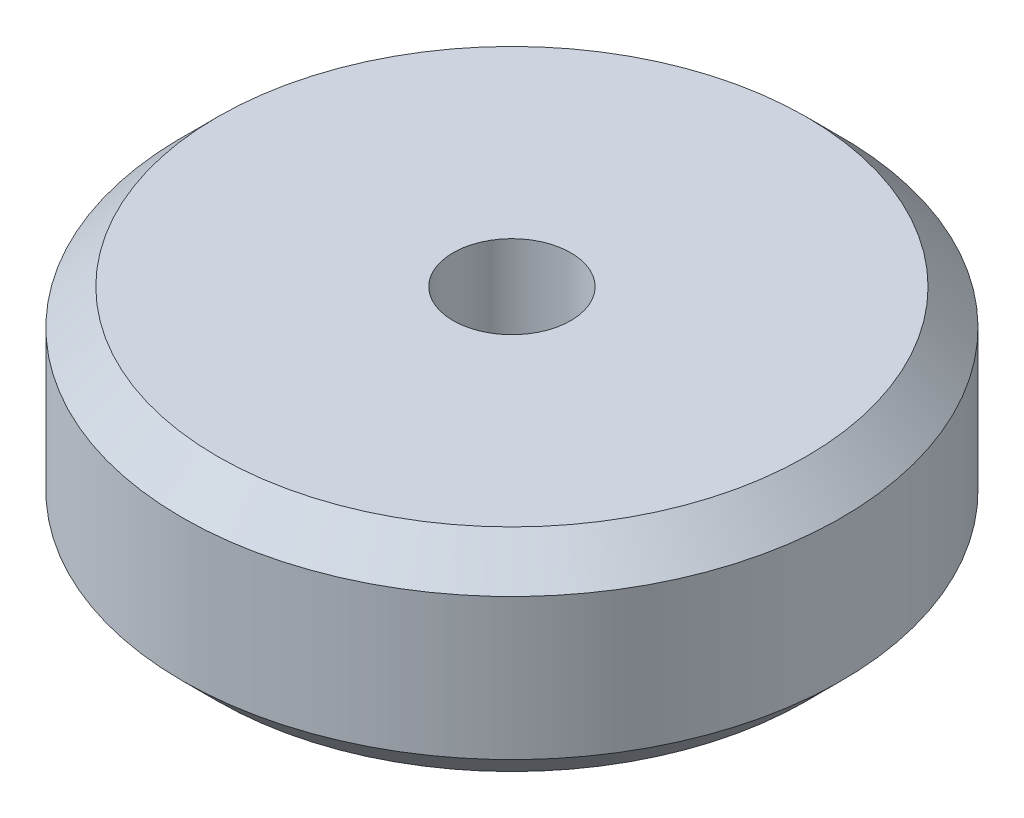
ISO-10303-21;
HEADER;
FILE_DESCRIPTION(('STEP AP214'),'2;1');
FILE_NAME('part.step','',(''),(''),'','','');
FILE_SCHEMA(('AUTOMOTIVE_DESIGN { 1 0 10303 214 1 1 1 1 }'));
ENDSEC;
DATA;
#1=APPLICATION_CONTEXT('core data for automotive mechanical design processes');
#2=APPLICATION_PROTOCOL_DEFINITION('international standard','automotive_design',2000,#1);
#3=PRODUCT_CONTEXT('',#1,'mechanical');
#4=PRODUCT('Part','Part','',(#3));
#5=PRODUCT_RELATED_PRODUCT_CATEGORY('part','',(#4));
#6=PRODUCT_DEFINITION_FORMATION('','',#4);
#7=PRODUCT_DEFINITION_CONTEXT('part definition',#1,'design');
#8=PRODUCT_DEFINITION('design','',#6,#7);
#9=PRODUCT_DEFINITION_SHAPE('','',#8);
#10=(LENGTH_UNIT() NAMED_UNIT(*) SI_UNIT(.MILLI.,.METRE.));
#11=(NAMED_UNIT(*) PLANE_ANGLE_UNIT() SI_UNIT($,.RADIAN.));
#12=(NAMED_UNIT(*) SI_UNIT($,.STERADIAN.) SOLID_ANGLE_UNIT());
#13=UNCERTAINTY_MEASURE_WITH_UNIT(LENGTH_MEASURE(1.E-05),#10,'distance_accuracy_value','');
#14=(GEOMETRIC_REPRESENTATION_CONTEXT(3) GLOBAL_UNCERTAINTY_ASSIGNED_CONTEXT((#13)) GLOBAL_UNIT_ASSIGNED_CONTEXT((#10,
#11,#12)) REPRESENTATION_CONTEXT('',''));
#15=CARTESIAN_POINT('',(0.,0.,0.));
#16=DIRECTION('',(0.,0.,1.));
#17=DIRECTION('',(1.,0.,0.));
#18=AXIS2_PLACEMENT_3D('',#15,#16,#17);
#19=CARTESIAN_POINT('',(0.,9.,0.));
#20=DIRECTION('',(0.,1.,0.));
#21=DIRECTION('',(0.,0.,1.));
#22=AXIS2_PLACEMENT_3D('',#19,#20,#21);
#23=PLANE('',#22);
#24=CARTESIAN_POINT('',(0.,9.,0.));
#25=DIRECTION('',(0.,1.,0.));
#26=DIRECTION('',(0.,0.,1.));
#27=AXIS2_PLACEMENT_3D('',#24,#25,#26);
#28=CIRCLE('',#27,12.5);
#29=CARTESIAN_POINT('',(0.,9.,12.5));
#30=VERTEX_POINT('',#29);
#31=EDGE_CURVE('E10',#30,#30,#28,.T.);
#32=ORIENTED_EDGE('',*,*,#31,.T.);
#33=EDGE_LOOP('',(#32));
#34=FACE_BOUND('',#33,.T.);
#35=CARTESIAN_POINT('',(0.,9.,0.));
#36=DIRECTION('',(0.,1.,0.));
#37=DIRECTION('',(0.,0.,1.));
#38=AXIS2_PLACEMENT_3D('',#35,#36,#37);
#39=CIRCLE('',#38,2.5);
#40=CARTESIAN_POINT('',(0.,9.,2.5));
#41=VERTEX_POINT('',#40);
#42=EDGE_CURVE('E62',#41,#41,#39,.T.);
#43=ORIENTED_EDGE('',*,*,#42,.F.);
#44=EDGE_LOOP('',(#43));
#45=FACE_BOUND('',#44,.T.);
#46=ADVANCED_FACE('F41',(#34,#45),#23,.T.);
#47=CARTESIAN_POINT('',(0.,0.,0.));
#48=DIRECTION('',(0.,1.,0.));
#49=DIRECTION('',(0.,0.,1.));
#50=AXIS2_PLACEMENT_3D('',#47,#48,#49);
#51=PLANE('',#50);
#52=CARTESIAN_POINT('',(0.,0.,0.));
#53=DIRECTION('',(0.,1.,0.));
#54=DIRECTION('',(0.,0.,1.));
#55=AXIS2_PLACEMENT_3D('',#52,#53,#54);
#56=CIRCLE('',#55,12.5);
#57=CARTESIAN_POINT('',(0.,0.,12.5));
#58=VERTEX_POINT('',#57);
#59=EDGE_CURVE('E49',#58,#58,#56,.F.);
#60=ORIENTED_EDGE('',*,*,#59,.T.);
#61=EDGE_LOOP('',(#60));
#62=FACE_BOUND('',#61,.T.);
#63=CARTESIAN_POINT('',(0.,0.,0.));
#64=DIRECTION('',(0.,1.,0.));
#65=DIRECTION('',(0.,0.,1.));
#66=AXIS2_PLACEMENT_3D('',#63,#64,#65);
#67=CIRCLE('',#66,2.5);
#68=CARTESIAN_POINT('',(0.,0.,2.5));
#69=VERTEX_POINT('',#68);
#70=EDGE_CURVE('E63',#69,#69,#67,.T.);
#71=ORIENTED_EDGE('',*,*,#70,.T.);
#72=EDGE_LOOP('',(#71));
#73=FACE_BOUND('',#72,.T.);
#74=ADVANCED_FACE('F73',(#62,#73),#51,.F.);
#75=CARTESIAN_POINT('',(0.,9.,0.));
#76=DIRECTION('',(0.,-1.,0.));
#77=DIRECTION('',(0.,0.,-1.));
#78=AXIS2_PLACEMENT_3D('',#75,#76,#77);
#79=CYLINDRICAL_SURFACE('',#78,14.);
#80=CARTESIAN_POINT('',(0.,1.5,0.));
#81=DIRECTION('',(0.,1.,0.));
#82=DIRECTION('',(0.,0.,1.));
#83=AXIS2_PLACEMENT_3D('',#80,#81,#82);
#84=CIRCLE('',#83,14.);
#85=CARTESIAN_POINT('',(0.,1.5,14.));
#86=VERTEX_POINT('',#85);
#87=EDGE_CURVE('E53',#86,#86,#84,.T.);
#88=ORIENTED_EDGE('',*,*,#87,.T.);
#89=EDGE_LOOP('',(#88));
#90=FACE_BOUND('',#89,.T.);
#91=CARTESIAN_POINT('',(0.,7.49999999999999,0.));
#92=DIRECTION('',(0.,1.,0.));
#93=DIRECTION('',(0.,0.,1.));
#94=AXIS2_PLACEMENT_3D('',#91,#92,#93);
#95=CIRCLE('',#94,14.);
#96=CARTESIAN_POINT('',(0.,7.49999999999999,14.));
#97=VERTEX_POINT('',#96);
#98=EDGE_CURVE('E57',#97,#97,#95,.F.);
#99=ORIENTED_EDGE('',*,*,#98,.T.);
#100=EDGE_LOOP('',(#99));
#101=FACE_BOUND('',#100,.T.);
#102=ADVANCED_FACE('F79',(#90,#101),#79,.T.);
#103=CARTESIAN_POINT('',(0.,9.,0.));
#104=DIRECTION('',(0.,-1.,0.));
#105=DIRECTION('',(0.,0.,-1.));
#106=AXIS2_PLACEMENT_3D('',#103,#104,#105);
#107=CYLINDRICAL_SURFACE('',#106,2.5);
#108=ORIENTED_EDGE('',*,*,#42,.T.);
#109=EDGE_LOOP('',(#108));
#110=FACE_BOUND('',#109,.T.);
#111=ORIENTED_EDGE('',*,*,#70,.F.);
#112=EDGE_LOOP('',(#111));
#113=FACE_BOUND('',#112,.T.);
#114=ADVANCED_FACE('F69',(#110,#113),#107,.F.);
#115=CARTESIAN_POINT('',(0.,1.5,0.));
#116=DIRECTION('',(0.,1.,0.));
#117=DIRECTION('',(0.,0.,1.));
#118=AXIS2_PLACEMENT_3D('',#115,#116,#117);
#119=CONICAL_SURFACE('',#118,14.,0.785398163397451);
#120=CARTESIAN_POINT('',(0.,0.,12.5));
#121=CARTESIAN_POINT('',(0.,0.0156249999999997,12.515625));
#122=CARTESIAN_POINT('',(0.,0.0312499999999998,12.53125));
#123=CARTESIAN_POINT('',(0.,0.0624999999999999,12.5625));
#124=CARTESIAN_POINT('',(0.,0.078125,12.578125));
#125=CARTESIAN_POINT('',(0.,0.109375,12.609375));
#126=CARTESIAN_POINT('',(0.,0.125,12.625));
#127=CARTESIAN_POINT('',(0.,0.15625,12.65625));
#128=CARTESIAN_POINT('',(0.,0.171875,12.671875));
#129=CARTESIAN_POINT('',(0.,0.203125,12.703125));
#130=CARTESIAN_POINT('',(0.,0.21875,12.71875));
#131=CARTESIAN_POINT('',(0.,0.25,12.75));
#132=CARTESIAN_POINT('',(0.,0.265625,12.765625));
#133=CARTESIAN_POINT('',(0.,0.296875000000001,12.796875));
#134=CARTESIAN_POINT('',(0.,0.3125,12.8125));
#135=CARTESIAN_POINT('',(0.,0.34375,12.84375));
#136=CARTESIAN_POINT('',(0.,0.359375000000001,12.859375));
#137=CARTESIAN_POINT('',(0.,0.390625000000001,12.890625));
#138=CARTESIAN_POINT('',(0.,0.406250000000001,12.90625));
#139=CARTESIAN_POINT('',(0.,0.437500000000001,12.9375));
#140=CARTESIAN_POINT('',(0.,0.453125000000001,12.953125));
#141=CARTESIAN_POINT('',(0.,0.484375000000001,12.984375));
#142=CARTESIAN_POINT('',(0.,0.500000000000001,13.));
#143=CARTESIAN_POINT('',(0.,0.531250000000001,13.03125));
#144=CARTESIAN_POINT('',(0.,0.546875000000001,13.046875));
#145=CARTESIAN_POINT('',(0.,0.578125000000001,13.078125));
#146=CARTESIAN_POINT('',(0.,0.593750000000001,13.09375));
#147=CARTESIAN_POINT('',(0.,0.625000000000001,13.125));
#148=CARTESIAN_POINT('',(0.,0.640625000000001,13.140625));
#149=CARTESIAN_POINT('',(0.,0.671875000000001,13.171875));
#150=CARTESIAN_POINT('',(0.,0.687500000000001,13.1875));
#151=CARTESIAN_POINT('',(0.,0.718750000000001,13.21875));
#152=CARTESIAN_POINT('',(0.,0.734375000000002,13.234375));
#153=CARTESIAN_POINT('',(0.,0.765625000000002,13.265625));
#154=CARTESIAN_POINT('',(0.,0.781250000000001,13.28125));
#155=CARTESIAN_POINT('',(0.,0.812500000000001,13.3125));
#156=CARTESIAN_POINT('',(0.,0.828125000000001,13.328125));
#157=CARTESIAN_POINT('',(0.,0.859375000000002,13.359375));
#158=CARTESIAN_POINT('',(0.,0.875000000000002,13.375));
#159=CARTESIAN_POINT('',(0.,0.906250000000002,13.40625));
#160=CARTESIAN_POINT('',(0.,0.921875000000002,13.421875));
#161=CARTESIAN_POINT('',(0.,0.953125000000002,13.453125));
#162=CARTESIAN_POINT('',(0.,0.968750000000002,13.46875));
#163=CARTESIAN_POINT('',(0.,1.,13.5));
#164=CARTESIAN_POINT('',(0.,1.015625,13.515625));
#165=CARTESIAN_POINT('',(0.,1.046875,13.546875));
#166=CARTESIAN_POINT('',(0.,1.0625,13.5625));
#167=CARTESIAN_POINT('',(0.,1.09375,13.59375));
#168=CARTESIAN_POINT('',(0.,1.109375,13.609375));
#169=CARTESIAN_POINT('',(0.,1.140625,13.640625));
#170=CARTESIAN_POINT('',(0.,1.15625,13.65625));
#171=CARTESIAN_POINT('',(0.,1.1875,13.6875));
#172=CARTESIAN_POINT('',(0.,1.203125,13.703125));
#173=CARTESIAN_POINT('',(0.,1.234375,13.734375));
#174=CARTESIAN_POINT('',(0.,1.25,13.75));
#175=CARTESIAN_POINT('',(0.,1.28125,13.78125));
#176=CARTESIAN_POINT('',(0.,1.296875,13.796875));
#177=CARTESIAN_POINT('',(0.,1.328125,13.828125));
#178=CARTESIAN_POINT('',(0.,1.34375,13.84375));
#179=CARTESIAN_POINT('',(0.,1.375,13.875));
#180=CARTESIAN_POINT('',(0.,1.390625,13.890625));
#181=CARTESIAN_POINT('',(0.,1.421875,13.921875));
#182=CARTESIAN_POINT('',(0.,1.4375,13.9375));
#183=CARTESIAN_POINT('',(0.,1.46875,13.96875));
#184=CARTESIAN_POINT('',(0.,1.484375,13.984375));
#185=CARTESIAN_POINT('',(0.,1.5,14.));
#186=B_SPLINE_CURVE_WITH_KNOTS('',3,(#120,#121,#122,#123,#124,#125,#126,#127,#128,#129,#130,
#131,#132,#133,#134,#135,#136,#137,#138,#139,#140,#141,#142,#143,#144,#145,#146,#147,#148,#149,
#150,#151,#152,#153,#154,#155,#156,#157,#158,#159,#160,#161,#162,#163,#164,#165,#166,#167,#168,
#169,#170,#171,#172,#173,#174,#175,#176,#177,#178,#179,#180,#181,#182,#183,#184,#185),
.UNSPECIFIED.,.F.,.F.,(4,2,2,2,2,2,2,2,2,2,2,2,2,2,2,2,2,2,2,2,2,2,2,2,2,2,2,2,2,2,2,2,4),(0.,
0.0662912607362389,0.132582521472478,0.198873782208717,0.265165042944956,0.331456303681196,
0.397747564417435,0.464038825153674,0.530330085889913,0.596621346626152,0.662912607362391,
0.729203868098631,0.79549512883487,0.861786389571109,0.928077650307348,0.994368911043586,
1.06066017177983,1.12695143251607,1.1932426932523,1.25953395398854,1.32582521472478,
1.39211647546102,1.45840773619726,1.5246989969335,1.59099025766974,1.65728151840598,
1.72357277914222,1.78986403987846,1.85615530061469,1.92244656135093,1.98873782208717,
2.05502908282341,2.12132034355965),.UNSPECIFIED.);
#187=EDGE_CURVE('BSEAM86',#58,#86,#186,.T.);
#188=ORIENTED_EDGE('',*,*,#59,.F.);
#189=ORIENTED_EDGE('',*,*,#87,.F.);
#190=ORIENTED_EDGE('',*,*,#187,.T.);
#191=ORIENTED_EDGE('',*,*,#187,.F.);
#192=EDGE_LOOP('',(#188,#190,#189,#191));
#193=FACE_BOUND('',#192,.T.);
#194=ADVANCED_FACE('F86',(#193),#119,.T.);
#195=CARTESIAN_POINT('',(0.,9.,0.));
#196=DIRECTION('',(0.,-1.,0.));
#197=DIRECTION('',(0.,0.,-1.));
#198=AXIS2_PLACEMENT_3D('',#195,#196,#197);
#199=CONICAL_SURFACE('',#198,12.5,0.785398163397446);
#200=ORIENTED_EDGE('',*,*,#98,.F.);
#201=EDGE_LOOP('',(#200));
#202=FACE_BOUND('',#201,.T.);
#203=ORIENTED_EDGE('',*,*,#31,.F.);
#204=EDGE_LOOP('',(#203));
#205=FACE_BOUND('',#204,.T.);
#206=ADVANCED_FACE('F44',(#202,#205),#199,.T.);
#207=CLOSED_SHELL('',(#46,#74,#102,#114,#194,#206));
#208=MANIFOLD_SOLID_BREP('B2',#207);
#209=ADVANCED_BREP_SHAPE_REPRESENTATION('',(#18,#208),#14);
#210=SHAPE_DEFINITION_REPRESENTATION(#9,#209);
ENDSEC;
END-ISO-10303-21;
